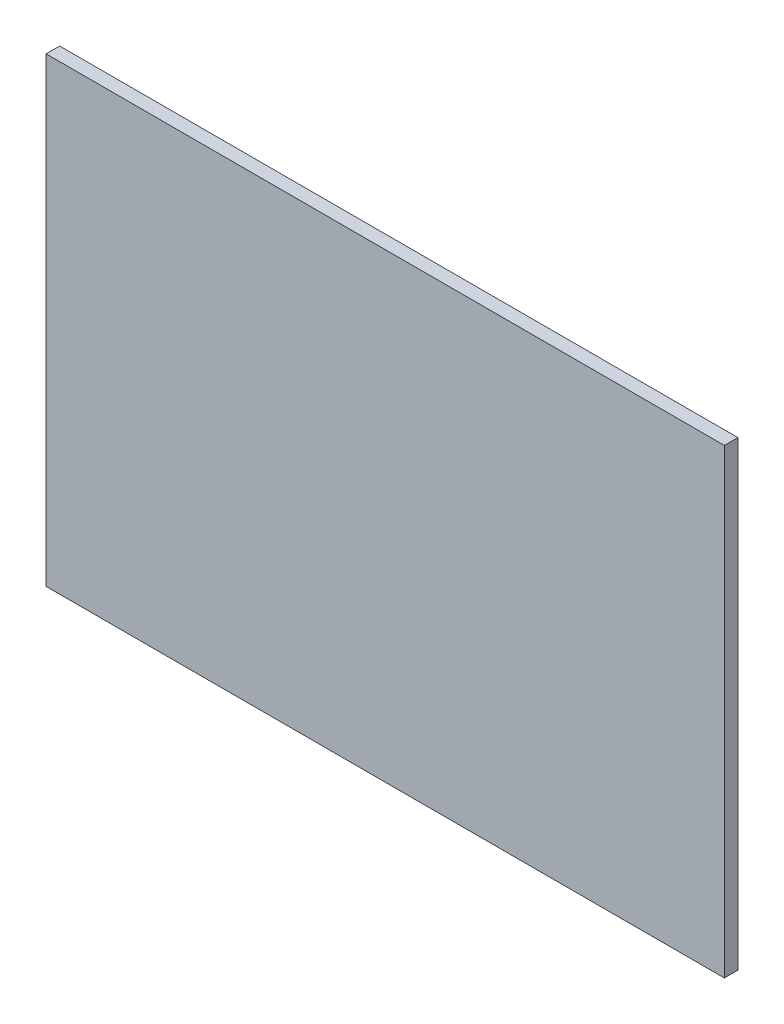
ISO-10303-21;
HEADER;
FILE_DESCRIPTION(('STEP AP214'),'2;1');
FILE_NAME('part.step','',(''),(''),'','','');
FILE_SCHEMA(('AUTOMOTIVE_DESIGN { 1 0 10303 214 1 1 1 1 }'));
ENDSEC;
DATA;
#1=APPLICATION_CONTEXT('core data for automotive mechanical design processes');
#2=APPLICATION_PROTOCOL_DEFINITION('international standard','automotive_design',2000,#1);
#3=PRODUCT_CONTEXT('',#1,'mechanical');
#4=PRODUCT('Part','Part','',(#3));
#5=PRODUCT_RELATED_PRODUCT_CATEGORY('part','',(#4));
#6=PRODUCT_DEFINITION_FORMATION('','',#4);
#7=PRODUCT_DEFINITION_CONTEXT('part definition',#1,'design');
#8=PRODUCT_DEFINITION('design','',#6,#7);
#9=PRODUCT_DEFINITION_SHAPE('','',#8);
#10=(LENGTH_UNIT() NAMED_UNIT(*) SI_UNIT(.MILLI.,.METRE.));
#11=(NAMED_UNIT(*) PLANE_ANGLE_UNIT() SI_UNIT($,.RADIAN.));
#12=(NAMED_UNIT(*) SI_UNIT($,.STERADIAN.) SOLID_ANGLE_UNIT());
#13=UNCERTAINTY_MEASURE_WITH_UNIT(LENGTH_MEASURE(1.E-05),#10,'distance_accuracy_value','');
#14=(GEOMETRIC_REPRESENTATION_CONTEXT(3) GLOBAL_UNCERTAINTY_ASSIGNED_CONTEXT((#13)) GLOBAL_UNIT_ASSIGNED_CONTEXT((#10,
#11,#12)) REPRESENTATION_CONTEXT('',''));
#15=CARTESIAN_POINT('',(0.,0.,0.));
#16=DIRECTION('',(0.,0.,1.));
#17=DIRECTION('',(1.,0.,0.));
#18=AXIS2_PLACEMENT_3D('',#15,#16,#17);
#19=CARTESIAN_POINT('',(50.,-34.,2.));
#20=DIRECTION('',(-1.,0.,0.));
#21=DIRECTION('',(0.,0.,1.));
#22=AXIS2_PLACEMENT_3D('',#19,#20,#21);
#23=PLANE('',#22);
#24=DIRECTION('',(0.,1.,0.));
#25=VECTOR('',#24,1.);
#26=CARTESIAN_POINT('',(50.,-34.,0.));
#27=LINE('',#26,#25);
#28=CARTESIAN_POINT('',(50.,-34.,0.));
#29=VERTEX_POINT('',#28);
#30=CARTESIAN_POINT('',(50.,34.,0.));
#31=VERTEX_POINT('',#30);
#32=EDGE_CURVE('E109',#29,#31,#27,.T.);
#33=ORIENTED_EDGE('',*,*,#32,.T.);
#34=DIRECTION('',(0.,0.,-1.));
#35=VECTOR('',#34,1.);
#36=CARTESIAN_POINT('',(50.,34.,2.));
#37=LINE('',#36,#35);
#38=CARTESIAN_POINT('',(50.,34.,2.));
#39=VERTEX_POINT('',#38);
#40=EDGE_CURVE('E11',#39,#31,#37,.T.);
#41=ORIENTED_EDGE('',*,*,#40,.F.);
#42=DIRECTION('',(0.,1.,0.));
#43=VECTOR('',#42,1.);
#44=CARTESIAN_POINT('',(50.,-34.,2.));
#45=LINE('',#44,#43);
#46=CARTESIAN_POINT('',(50.,-34.,2.));
#47=VERTEX_POINT('',#46);
#48=EDGE_CURVE('E93',#47,#39,#45,.T.);
#49=ORIENTED_EDGE('',*,*,#48,.F.);
#50=DIRECTION('',(0.,0.,-1.));
#51=VECTOR('',#50,1.);
#52=CARTESIAN_POINT('',(50.,-34.,2.));
#53=LINE('',#52,#51);
#54=EDGE_CURVE('E105',#47,#29,#53,.T.);
#55=ORIENTED_EDGE('',*,*,#54,.T.);
#56=EDGE_LOOP('',(#33,#41,#49,#55));
#57=FACE_BOUND('',#56,.T.);
#58=ADVANCED_FACE('F41',(#57),#23,.F.);
#59=CARTESIAN_POINT('',(-50.,34.,2.));
#60=DIRECTION('',(0.,-1.,0.));
#61=DIRECTION('',(0.,0.,-1.));
#62=AXIS2_PLACEMENT_3D('',#59,#60,#61);
#63=PLANE('',#62);
#64=DIRECTION('',(-1.,0.,0.));
#65=VECTOR('',#64,1.);
#66=CARTESIAN_POINT('',(-50.,34.,0.));
#67=LINE('',#66,#65);
#68=CARTESIAN_POINT('',(-50.,34.,0.));
#69=VERTEX_POINT('',#68);
#70=EDGE_CURVE('E98',#31,#69,#67,.T.);
#71=ORIENTED_EDGE('',*,*,#70,.T.);
#72=DIRECTION('',(0.,0.,-1.));
#73=VECTOR('',#72,1.);
#74=CARTESIAN_POINT('',(-50.,34.,2.));
#75=LINE('',#74,#73);
#76=CARTESIAN_POINT('',(-50.,34.,2.));
#77=VERTEX_POINT('',#76);
#78=EDGE_CURVE('E50',#77,#69,#75,.T.);
#79=ORIENTED_EDGE('',*,*,#78,.F.);
#80=DIRECTION('',(-1.,0.,0.));
#81=VECTOR('',#80,1.);
#82=CARTESIAN_POINT('',(-50.,34.,2.));
#83=LINE('',#82,#81);
#84=EDGE_CURVE('E88',#39,#77,#83,.T.);
#85=ORIENTED_EDGE('',*,*,#84,.F.);
#86=ORIENTED_EDGE('',*,*,#40,.T.);
#87=EDGE_LOOP('',(#71,#79,#85,#86));
#88=FACE_BOUND('',#87,.T.);
#89=ADVANCED_FACE('F97',(#88),#63,.F.);
#90=CARTESIAN_POINT('',(-50.,-34.,2.));
#91=DIRECTION('',(1.,0.,0.));
#92=DIRECTION('',(0.,0.,-1.));
#93=AXIS2_PLACEMENT_3D('',#90,#91,#92);
#94=PLANE('',#93);
#95=DIRECTION('',(0.,-1.,0.));
#96=VECTOR('',#95,1.);
#97=CARTESIAN_POINT('',(-50.,-34.,0.));
#98=LINE('',#97,#96);
#99=CARTESIAN_POINT('',(-50.,-34.,0.));
#100=VERTEX_POINT('',#99);
#101=EDGE_CURVE('E75',#69,#100,#98,.T.);
#102=ORIENTED_EDGE('',*,*,#101,.T.);
#103=DIRECTION('',(0.,0.,-1.));
#104=VECTOR('',#103,1.);
#105=CARTESIAN_POINT('',(-50.,-34.,2.));
#106=LINE('',#105,#104);
#107=CARTESIAN_POINT('',(-50.,-34.,2.));
#108=VERTEX_POINT('',#107);
#109=EDGE_CURVE('E100',#108,#100,#106,.T.);
#110=ORIENTED_EDGE('',*,*,#109,.F.);
#111=DIRECTION('',(0.,-1.,0.));
#112=VECTOR('',#111,1.);
#113=CARTESIAN_POINT('',(-50.,-34.,2.));
#114=LINE('',#113,#112);
#115=EDGE_CURVE('E91',#77,#108,#114,.T.);
#116=ORIENTED_EDGE('',*,*,#115,.F.);
#117=ORIENTED_EDGE('',*,*,#78,.T.);
#118=EDGE_LOOP('',(#102,#110,#116,#117));
#119=FACE_BOUND('',#118,.T.);
#120=ADVANCED_FACE('F101',(#119),#94,.F.);
#121=CARTESIAN_POINT('',(-50.,-34.,2.));
#122=DIRECTION('',(0.,1.,0.));
#123=DIRECTION('',(0.,0.,1.));
#124=AXIS2_PLACEMENT_3D('',#121,#122,#123);
#125=PLANE('',#124);
#126=DIRECTION('',(1.,0.,0.));
#127=VECTOR('',#126,1.);
#128=CARTESIAN_POINT('',(-50.,-34.,0.));
#129=LINE('',#128,#127);
#130=EDGE_CURVE('E81',#100,#29,#129,.T.);
#131=ORIENTED_EDGE('',*,*,#130,.T.);
#132=ORIENTED_EDGE('',*,*,#54,.F.);
#133=DIRECTION('',(1.,0.,0.));
#134=VECTOR('',#133,1.);
#135=CARTESIAN_POINT('',(-50.,-34.,2.));
#136=LINE('',#135,#134);
#137=EDGE_CURVE('E58',#108,#47,#136,.T.);
#138=ORIENTED_EDGE('',*,*,#137,.F.);
#139=ORIENTED_EDGE('',*,*,#109,.T.);
#140=EDGE_LOOP('',(#131,#132,#138,#139));
#141=FACE_BOUND('',#140,.T.);
#142=ADVANCED_FACE('F122',(#141),#125,.F.);
#143=CARTESIAN_POINT('',(0.,0.,2.));
#144=DIRECTION('',(0.,0.,-1.));
#145=DIRECTION('',(-1.,0.,0.));
#146=AXIS2_PLACEMENT_3D('',#143,#144,#145);
#147=PLANE('',#146);
#148=ORIENTED_EDGE('',*,*,#48,.T.);
#149=ORIENTED_EDGE('',*,*,#84,.T.);
#150=ORIENTED_EDGE('',*,*,#115,.T.);
#151=ORIENTED_EDGE('',*,*,#137,.T.);
#152=EDGE_LOOP('',(#148,#149,#150,#151));
#153=FACE_BOUND('',#152,.T.);
#154=ADVANCED_FACE('F89',(#153),#147,.F.);
#155=CARTESIAN_POINT('',(0.,0.,0.));
#156=DIRECTION('',(0.,0.,-1.));
#157=DIRECTION('',(-1.,0.,0.));
#158=AXIS2_PLACEMENT_3D('',#155,#156,#157);
#159=PLANE('',#158);
#160=ORIENTED_EDGE('',*,*,#32,.F.);
#161=ORIENTED_EDGE('',*,*,#130,.F.);
#162=ORIENTED_EDGE('',*,*,#101,.F.);
#163=ORIENTED_EDGE('',*,*,#70,.F.);
#164=EDGE_LOOP('',(#160,#161,#162,#163));
#165=FACE_BOUND('',#164,.T.);
#166=ADVANCED_FACE('F125',(#165),#159,.T.);
#167=CLOSED_SHELL('',(#58,#89,#120,#142,#154,#166));
#168=MANIFOLD_SOLID_BREP('B2',#167);
#169=ADVANCED_BREP_SHAPE_REPRESENTATION('',(#18,#168),#14);
#170=SHAPE_DEFINITION_REPRESENTATION(#9,#169);
ENDSEC;
END-ISO-10303-21;
